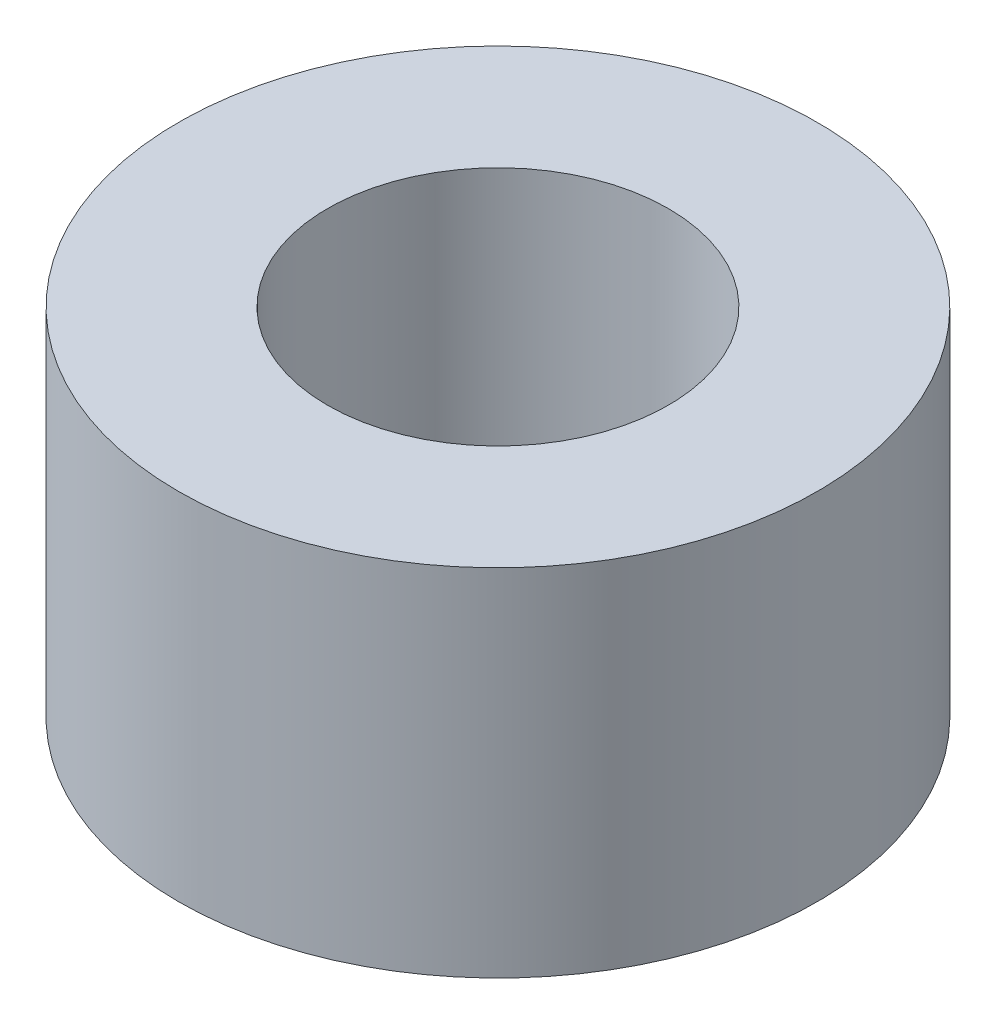
ISO-10303-21;
HEADER;
FILE_DESCRIPTION(('STEP AP214'),'2;1');
FILE_NAME('part.step','',(''),(''),'','','');
FILE_SCHEMA(('AUTOMOTIVE_DESIGN { 1 0 10303 214 1 1 1 1 }'));
ENDSEC;
DATA;
#1=APPLICATION_CONTEXT('core data for automotive mechanical design processes');
#2=APPLICATION_PROTOCOL_DEFINITION('international standard','automotive_design',2000,#1);
#3=PRODUCT_CONTEXT('',#1,'mechanical');
#4=PRODUCT('Part','Part','',(#3));
#5=PRODUCT_RELATED_PRODUCT_CATEGORY('part','',(#4));
#6=PRODUCT_DEFINITION_FORMATION('','',#4);
#7=PRODUCT_DEFINITION_CONTEXT('part definition',#1,'design');
#8=PRODUCT_DEFINITION('design','',#6,#7);
#9=PRODUCT_DEFINITION_SHAPE('','',#8);
#10=(LENGTH_UNIT() NAMED_UNIT(*) SI_UNIT(.MILLI.,.METRE.));
#11=(NAMED_UNIT(*) PLANE_ANGLE_UNIT() SI_UNIT($,.RADIAN.));
#12=(NAMED_UNIT(*) SI_UNIT($,.STERADIAN.) SOLID_ANGLE_UNIT());
#13=UNCERTAINTY_MEASURE_WITH_UNIT(LENGTH_MEASURE(1.E-05),#10,'distance_accuracy_value','');
#14=(GEOMETRIC_REPRESENTATION_CONTEXT(3) GLOBAL_UNCERTAINTY_ASSIGNED_CONTEXT((#13)) GLOBAL_UNIT_ASSIGNED_CONTEXT((#10,
#11,#12)) REPRESENTATION_CONTEXT('',''));
#15=CARTESIAN_POINT('',(0.,0.,0.));
#16=DIRECTION('',(0.,0.,1.));
#17=DIRECTION('',(1.,0.,0.));
#18=AXIS2_PLACEMENT_3D('',#15,#16,#17);
#19=CARTESIAN_POINT('',(0.,-8.34,0.));
#20=DIRECTION('',(0.,1.,0.));
#21=DIRECTION('',(0.,0.,1.));
#22=AXIS2_PLACEMENT_3D('',#19,#20,#21);
#23=CYLINDRICAL_SURFACE('',#22,7.5);
#24=CARTESIAN_POINT('',(0.,-8.34,0.));
#25=DIRECTION('',(0.,1.,0.));
#26=DIRECTION('',(0.,0.,1.));
#27=AXIS2_PLACEMENT_3D('',#24,#25,#26);
#28=CIRCLE('',#27,7.5);
#29=CARTESIAN_POINT('',(0.,-8.34,7.5));
#30=VERTEX_POINT('',#29);
#31=EDGE_CURVE('E10',#30,#30,#28,.T.);
#32=ORIENTED_EDGE('',*,*,#31,.T.);
#33=EDGE_LOOP('',(#32));
#34=FACE_BOUND('',#33,.T.);
#35=CARTESIAN_POINT('',(0.,0.,0.));
#36=DIRECTION('',(0.,1.,0.));
#37=DIRECTION('',(0.,0.,1.));
#38=AXIS2_PLACEMENT_3D('',#35,#36,#37);
#39=CIRCLE('',#38,7.5);
#40=CARTESIAN_POINT('',(0.,0.,7.5));
#41=VERTEX_POINT('',#40);
#42=EDGE_CURVE('E40',#41,#41,#39,.T.);
#43=ORIENTED_EDGE('',*,*,#42,.F.);
#44=EDGE_LOOP('',(#43));
#45=FACE_BOUND('',#44,.T.);
#46=ADVANCED_FACE('F37',(#34,#45),#23,.T.);
#47=CARTESIAN_POINT('',(0.,-8.34,0.));
#48=DIRECTION('',(0.,1.,0.));
#49=DIRECTION('',(0.,0.,1.));
#50=AXIS2_PLACEMENT_3D('',#47,#48,#49);
#51=PLANE('',#50);
#52=CARTESIAN_POINT('',(0.,-8.34,0.));
#53=DIRECTION('',(0.,1.,0.));
#54=DIRECTION('',(0.,0.,1.));
#55=AXIS2_PLACEMENT_3D('',#52,#53,#54);
#56=CIRCLE('',#55,4.);
#57=CARTESIAN_POINT('',(0.,-8.34,4.));
#58=VERTEX_POINT('',#57);
#59=EDGE_CURVE('E49',#58,#58,#56,.T.);
#60=ORIENTED_EDGE('',*,*,#59,.T.);
#61=EDGE_LOOP('',(#60));
#62=FACE_BOUND('',#61,.T.);
#63=ORIENTED_EDGE('',*,*,#31,.F.);
#64=EDGE_LOOP('',(#63));
#65=FACE_BOUND('',#64,.T.);
#66=ADVANCED_FACE('F65',(#62,#65),#51,.F.);
#67=CARTESIAN_POINT('',(0.,0.,0.));
#68=DIRECTION('',(0.,1.,0.));
#69=DIRECTION('',(0.,0.,1.));
#70=AXIS2_PLACEMENT_3D('',#67,#68,#69);
#71=PLANE('',#70);
#72=CARTESIAN_POINT('',(0.,0.,0.));
#73=DIRECTION('',(0.,1.,0.));
#74=DIRECTION('',(0.,0.,1.));
#75=AXIS2_PLACEMENT_3D('',#72,#73,#74);
#76=CIRCLE('',#75,4.);
#77=CARTESIAN_POINT('',(0.,0.,4.));
#78=VERTEX_POINT('',#77);
#79=EDGE_CURVE('E54',#78,#78,#76,.T.);
#80=ORIENTED_EDGE('',*,*,#79,.F.);
#81=EDGE_LOOP('',(#80));
#82=FACE_BOUND('',#81,.T.);
#83=ORIENTED_EDGE('',*,*,#42,.T.);
#84=EDGE_LOOP('',(#83));
#85=FACE_BOUND('',#84,.T.);
#86=ADVANCED_FACE('F62',(#82,#85),#71,.T.);
#87=CARTESIAN_POINT('',(0.,-21.36,0.));
#88=DIRECTION('',(0.,1.,0.));
#89=DIRECTION('',(0.,0.,1.));
#90=AXIS2_PLACEMENT_3D('',#87,#88,#89);
#91=CYLINDRICAL_SURFACE('',#90,4.);
#92=CARTESIAN_POINT('',(0.,0.,4.));
#93=CARTESIAN_POINT('',(0.,-0.0868750000000001,4.));
#94=CARTESIAN_POINT('',(0.,-0.17375,4.));
#95=CARTESIAN_POINT('',(0.,-0.347500000000001,4.));
#96=CARTESIAN_POINT('',(0.,-0.434375000000001,4.));
#97=CARTESIAN_POINT('',(0.,-0.608125000000001,4.));
#98=CARTESIAN_POINT('',(0.,-0.695000000000001,4.));
#99=CARTESIAN_POINT('',(0.,-0.868750000000001,4.));
#100=CARTESIAN_POINT('',(0.,-0.955625000000002,4.));
#101=CARTESIAN_POINT('',(0.,-1.129375,4.));
#102=CARTESIAN_POINT('',(0.,-1.21625,4.));
#103=CARTESIAN_POINT('',(0.,-1.39,4.));
#104=CARTESIAN_POINT('',(0.,-1.476875,4.));
#105=CARTESIAN_POINT('',(0.,-1.650625,4.));
#106=CARTESIAN_POINT('',(0.,-1.7375,4.));
#107=CARTESIAN_POINT('',(0.,-1.91125,4.));
#108=CARTESIAN_POINT('',(0.,-1.998125,4.));
#109=CARTESIAN_POINT('',(0.,-2.171875,4.));
#110=CARTESIAN_POINT('',(0.,-2.25875,4.));
#111=CARTESIAN_POINT('',(0.,-2.4325,4.));
#112=CARTESIAN_POINT('',(0.,-2.519375,4.));
#113=CARTESIAN_POINT('',(0.,-2.693125,4.));
#114=CARTESIAN_POINT('',(0.,-2.78,4.));
#115=CARTESIAN_POINT('',(0.,-2.95375,4.));
#116=CARTESIAN_POINT('',(0.,-3.040625,4.));
#117=CARTESIAN_POINT('',(0.,-3.214375,4.));
#118=CARTESIAN_POINT('',(0.,-3.30125,4.));
#119=CARTESIAN_POINT('',(0.,-3.475,4.));
#120=CARTESIAN_POINT('',(0.,-3.561875,4.));
#121=CARTESIAN_POINT('',(0.,-3.735625,4.));
#122=CARTESIAN_POINT('',(0.,-3.8225,4.));
#123=CARTESIAN_POINT('',(0.,-3.99625,4.));
#124=CARTESIAN_POINT('',(0.,-4.083125,4.));
#125=CARTESIAN_POINT('',(0.,-4.256875,4.));
#126=CARTESIAN_POINT('',(0.,-4.34375,4.));
#127=CARTESIAN_POINT('',(0.,-4.5175,4.));
#128=CARTESIAN_POINT('',(0.,-4.604375,4.));
#129=CARTESIAN_POINT('',(0.,-4.778125,4.));
#130=CARTESIAN_POINT('',(0.,-4.865,4.));
#131=CARTESIAN_POINT('',(0.,-5.03875,4.));
#132=CARTESIAN_POINT('',(0.,-5.125625,4.));
#133=CARTESIAN_POINT('',(0.,-5.299375,4.));
#134=CARTESIAN_POINT('',(0.,-5.38625,4.));
#135=CARTESIAN_POINT('',(0.,-5.56,4.));
#136=CARTESIAN_POINT('',(0.,-5.646875,4.));
#137=CARTESIAN_POINT('',(0.,-5.820625,4.));
#138=CARTESIAN_POINT('',(0.,-5.9075,4.));
#139=CARTESIAN_POINT('',(0.,-6.08125,4.));
#140=CARTESIAN_POINT('',(0.,-6.168125,4.));
#141=CARTESIAN_POINT('',(0.,-6.341875,4.));
#142=CARTESIAN_POINT('',(0.,-6.42875,4.));
#143=CARTESIAN_POINT('',(0.,-6.6025,4.));
#144=CARTESIAN_POINT('',(0.,-6.689375,4.));
#145=CARTESIAN_POINT('',(0.,-6.863125,4.));
#146=CARTESIAN_POINT('',(0.,-6.95,4.));
#147=CARTESIAN_POINT('',(0.,-7.12375,4.));
#148=CARTESIAN_POINT('',(0.,-7.210625,4.));
#149=CARTESIAN_POINT('',(0.,-7.384375,4.));
#150=CARTESIAN_POINT('',(0.,-7.47125,4.));
#151=CARTESIAN_POINT('',(0.,-7.645,4.));
#152=CARTESIAN_POINT('',(0.,-7.731875,4.));
#153=CARTESIAN_POINT('',(0.,-7.905625,4.));
#154=CARTESIAN_POINT('',(0.,-7.9925,4.));
#155=CARTESIAN_POINT('',(0.,-8.16625,4.));
#156=CARTESIAN_POINT('',(0.,-8.253125,4.));
#157=CARTESIAN_POINT('',(0.,-8.34,4.));
#158=B_SPLINE_CURVE_WITH_KNOTS('',3,(#92,#93,#94,#95,#96,#97,#98,#99,#100,#101,#102,#103,#104,
#105,#106,#107,#108,#109,#110,#111,#112,#113,#114,#115,#116,#117,#118,#119,#120,#121,#122,#123,
#124,#125,#126,#127,#128,#129,#130,#131,#132,#133,#134,#135,#136,#137,#138,#139,#140,#141,#142,
#143,#144,#145,#146,#147,#148,#149,#150,#151,#152,#153,#154,#155,#156,#157),.UNSPECIFIED.,.F.,
.F.,(4,2,2,2,2,2,2,2,2,2,2,2,2,2,2,2,2,2,2,2,2,2,2,2,2,2,2,2,2,2,2,2,4),(0.,0.260625,
0.521250000000001,0.781875000000001,1.0425,1.303125,1.56375,1.824375,2.085,2.345625,2.60625,
2.866875,3.1275,3.388125,3.64875,3.909375,4.17,4.430625,4.69125,4.951875,5.2125,5.473125,
5.73375,5.994375,6.255,6.515625,6.77625,7.036875,7.2975,7.558125,7.81875,8.079375,8.34),.UNSPECIFIED.);
#159=EDGE_CURVE('BSEAM59',#78,#58,#158,.T.);
#160=ORIENTED_EDGE('',*,*,#79,.T.);
#161=ORIENTED_EDGE('',*,*,#59,.F.);
#162=ORIENTED_EDGE('',*,*,#159,.T.);
#163=ORIENTED_EDGE('',*,*,#159,.F.);
#164=EDGE_LOOP('',(#160,#162,#161,#163));
#165=FACE_BOUND('',#164,.T.);
#166=ADVANCED_FACE('F59',(#165),#91,.F.);
#167=CLOSED_SHELL('',(#46,#66,#86,#166));
#168=MANIFOLD_SOLID_BREP('B2',#167);
#169=ADVANCED_BREP_SHAPE_REPRESENTATION('',(#18,#168),#14);
#170=SHAPE_DEFINITION_REPRESENTATION(#9,#169);
ENDSEC;
END-ISO-10303-21;
